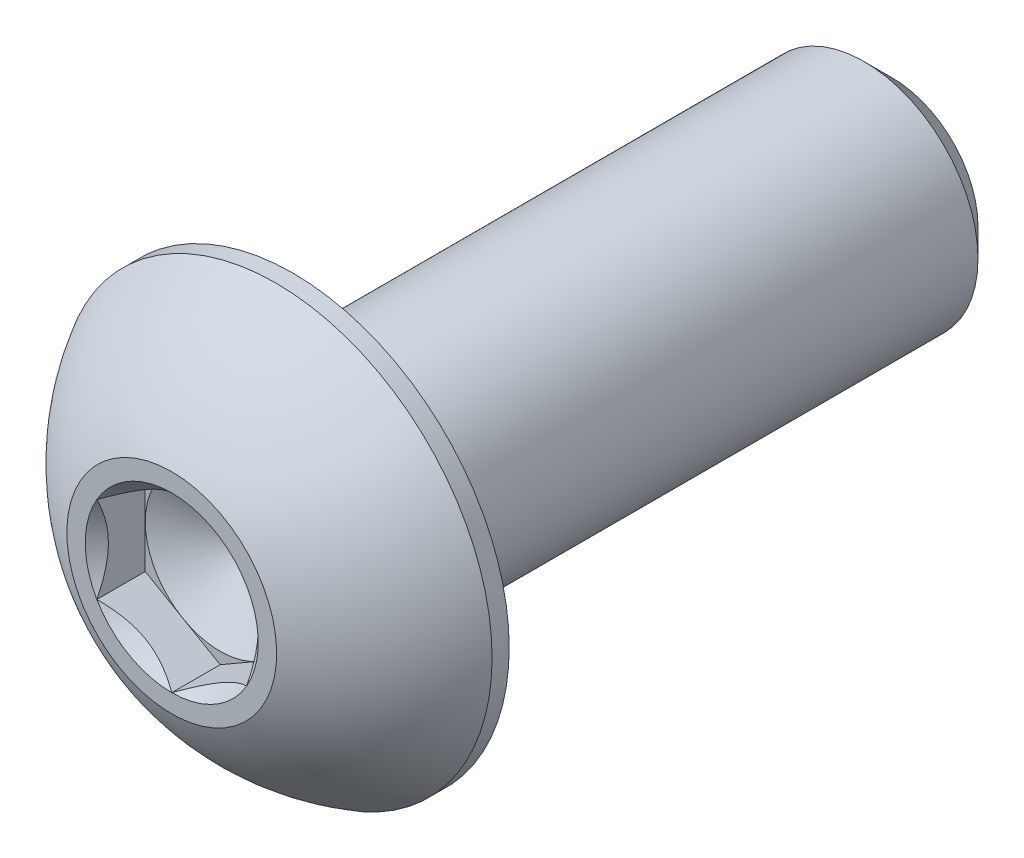
ISO-10303-21;
HEADER;
FILE_DESCRIPTION(('STEP AP214'),'2;1');
FILE_NAME('part.step','',(''),(''),'','','');
FILE_SCHEMA(('AUTOMOTIVE_DESIGN { 1 0 10303 214 1 1 1 1 }'));
ENDSEC;
DATA;
#1=APPLICATION_CONTEXT('core data for automotive mechanical design processes');
#2=APPLICATION_PROTOCOL_DEFINITION('international standard','automotive_design',2000,#1);
#3=PRODUCT_CONTEXT('',#1,'mechanical');
#4=PRODUCT('Part','Part','',(#3));
#5=PRODUCT_RELATED_PRODUCT_CATEGORY('part','',(#4));
#6=PRODUCT_DEFINITION_FORMATION('','',#4);
#7=PRODUCT_DEFINITION_CONTEXT('part definition',#1,'design');
#8=PRODUCT_DEFINITION('design','',#6,#7);
#9=PRODUCT_DEFINITION_SHAPE('','',#8);
#10=(LENGTH_UNIT() NAMED_UNIT(*) SI_UNIT(.MILLI.,.METRE.));
#11=(NAMED_UNIT(*) PLANE_ANGLE_UNIT() SI_UNIT($,.RADIAN.));
#12=(NAMED_UNIT(*) SI_UNIT($,.STERADIAN.) SOLID_ANGLE_UNIT());
#13=UNCERTAINTY_MEASURE_WITH_UNIT(LENGTH_MEASURE(1.E-05),#10,'distance_accuracy_value','');
#14=(GEOMETRIC_REPRESENTATION_CONTEXT(3) GLOBAL_UNCERTAINTY_ASSIGNED_CONTEXT((#13)) GLOBAL_UNIT_ASSIGNED_CONTEXT((#10,
#11,#12)) REPRESENTATION_CONTEXT('',''));
#15=CARTESIAN_POINT('',(0.,0.,0.));
#16=DIRECTION('',(0.,0.,1.));
#17=DIRECTION('',(1.,0.,0.));
#18=AXIS2_PLACEMENT_3D('',#15,#16,#17);
#19=CARTESIAN_POINT('',(0.,1.5875,7.6327));
#20=DIRECTION('',(0.,0.,-1.));
#21=DIRECTION('',(-1.,0.,0.));
#22=AXIS2_PLACEMENT_3D('',#19,#20,#21);
#23=PLANE('',#22);
#24=CARTESIAN_POINT('',(0.,0.,7.6327));
#25=DIRECTION('',(0.,0.,1.));
#26=DIRECTION('',(1.,0.,0.));
#27=AXIS2_PLACEMENT_3D('',#24,#25,#26);
#28=CIRCLE('',#27,2.2225);
#29=CARTESIAN_POINT('',(0.,2.2225,7.6327));
#30=VERTEX_POINT('',#29);
#31=EDGE_CURVE('E169',#30,#30,#28,.T.);
#32=ORIENTED_EDGE('',*,*,#31,.T.);
#33=EDGE_LOOP('',(#32));
#34=FACE_BOUND('',#33,.T.);
#35=CARTESIAN_POINT('',(0.,0.,7.6327));
#36=DIRECTION('',(0.,0.,1.));
#37=DIRECTION('',(1.,0.,0.));
#38=AXIS2_PLACEMENT_3D('',#35,#36,#37);
#39=CIRCLE('',#38,1.83308710467706);
#40=CARTESIAN_POINT('',(0.,1.83308710467706,7.6327));
#41=VERTEX_POINT('',#40);
#42=CARTESIAN_POINT('',(-1.5875,0.916543552338531,7.6327));
#43=VERTEX_POINT('',#42);
#44=EDGE_CURVE('E123',#41,#43,#39,.T.);
#45=ORIENTED_EDGE('',*,*,#44,.F.);
#46=CARTESIAN_POINT('',(0.,0.,7.6327));
#47=DIRECTION('',(0.,0.,1.));
#48=DIRECTION('',(1.,0.,0.));
#49=AXIS2_PLACEMENT_3D('',#46,#47,#48);
#50=CIRCLE('',#49,1.83308710467706);
#51=CARTESIAN_POINT('',(1.5875,0.916543552338531,7.6327));
#52=VERTEX_POINT('',#51);
#53=EDGE_CURVE('E108',#52,#41,#50,.T.);
#54=ORIENTED_EDGE('',*,*,#53,.F.);
#55=CARTESIAN_POINT('',(0.,0.,7.6327));
#56=DIRECTION('',(0.,0.,1.));
#57=DIRECTION('',(1.,0.,0.));
#58=AXIS2_PLACEMENT_3D('',#55,#56,#57);
#59=CIRCLE('',#58,1.83308710467706);
#60=CARTESIAN_POINT('',(1.5875,-0.916543552338531,7.6327));
#61=VERTEX_POINT('',#60);
#62=EDGE_CURVE('E119',#61,#52,#59,.T.);
#63=ORIENTED_EDGE('',*,*,#62,.F.);
#64=CARTESIAN_POINT('',(0.,0.,7.6327));
#65=DIRECTION('',(0.,0.,1.));
#66=DIRECTION('',(1.,0.,0.));
#67=AXIS2_PLACEMENT_3D('',#64,#65,#66);
#68=CIRCLE('',#67,1.83308710467706);
#69=CARTESIAN_POINT('',(0.,-1.83308710467706,7.6327));
#70=VERTEX_POINT('',#69);
#71=EDGE_CURVE('E140',#70,#61,#68,.T.);
#72=ORIENTED_EDGE('',*,*,#71,.F.);
#73=CARTESIAN_POINT('',(0.,0.,7.6327));
#74=DIRECTION('',(0.,0.,1.));
#75=DIRECTION('',(1.,0.,0.));
#76=AXIS2_PLACEMENT_3D('',#73,#74,#75);
#77=CIRCLE('',#76,1.83308710467706);
#78=CARTESIAN_POINT('',(-1.5875,-0.916543552338533,7.6327));
#79=VERTEX_POINT('',#78);
#80=EDGE_CURVE('E396',#79,#70,#77,.T.);
#81=ORIENTED_EDGE('',*,*,#80,.F.);
#82=CARTESIAN_POINT('',(0.,0.,7.6327));
#83=DIRECTION('',(0.,0.,1.));
#84=DIRECTION('',(1.,0.,0.));
#85=AXIS2_PLACEMENT_3D('',#82,#83,#84);
#86=CIRCLE('',#85,1.83308710467706);
#87=EDGE_CURVE('E405',#43,#79,#86,.T.);
#88=ORIENTED_EDGE('',*,*,#87,.F.);
#89=EDGE_LOOP('',(#45,#54,#63,#72,#81,#88));
#90=FACE_BOUND('',#89,.T.);
#91=ADVANCED_FACE('F35',(#34,#90),#23,.F.);
#92=CARTESIAN_POINT('',(0.,0.,-7.6327));
#93=DIRECTION('',(0.,0.,1.));
#94=DIRECTION('',(1.,0.,0.));
#95=AXIS2_PLACEMENT_3D('',#92,#93,#94);
#96=CONICAL_SURFACE('',#95,1.8176875,0.785398163397447);
#97=CARTESIAN_POINT('',(0.,0.,-7.0373875));
#98=DIRECTION('',(0.,0.,1.));
#99=DIRECTION('',(1.,0.,0.));
#100=AXIS2_PLACEMENT_3D('',#97,#98,#99);
#101=CIRCLE('',#100,2.413);
#102=CARTESIAN_POINT('',(2.413,0.,-7.0373875));
#103=VERTEX_POINT('',#102);
#104=EDGE_CURVE('E11',#103,#103,#101,.T.);
#105=ORIENTED_EDGE('',*,*,#104,.F.);
#106=EDGE_LOOP('',(#105));
#107=FACE_BOUND('',#106,.T.);
#108=CARTESIAN_POINT('',(0.,0.,-7.6327));
#109=DIRECTION('',(0.,0.,1.));
#110=DIRECTION('',(1.,0.,0.));
#111=AXIS2_PLACEMENT_3D('',#108,#109,#110);
#112=CIRCLE('',#111,1.8176875);
#113=CARTESIAN_POINT('',(1.8176875,0.,-7.6327));
#114=VERTEX_POINT('',#113);
#115=EDGE_CURVE('E162',#114,#114,#112,.T.);
#116=ORIENTED_EDGE('',*,*,#115,.T.);
#117=EDGE_LOOP('',(#116));
#118=FACE_BOUND('',#117,.T.);
#119=ADVANCED_FACE('F37',(#107,#118),#96,.T.);
#120=CARTESIAN_POINT('',(0.,0.,7.6327));
#121=DIRECTION('',(0.,0.,1.));
#122=DIRECTION('',(1.,0.,0.));
#123=AXIS2_PLACEMENT_3D('',#120,#121,#122);
#124=CYLINDRICAL_SURFACE('',#123,2.413);
#125=CARTESIAN_POINT('',(0.,0.,5.0673));
#126=DIRECTION('',(0.,0.,1.));
#127=DIRECTION('',(1.,0.,0.));
#128=AXIS2_PLACEMENT_3D('',#125,#126,#127);
#129=CIRCLE('',#128,2.413);
#130=CARTESIAN_POINT('',(2.413,0.,5.0673));
#131=VERTEX_POINT('',#130);
#132=EDGE_CURVE('E43',#131,#131,#129,.T.);
#133=ORIENTED_EDGE('',*,*,#132,.F.);
#134=EDGE_LOOP('',(#133));
#135=FACE_BOUND('',#134,.T.);
#136=ORIENTED_EDGE('',*,*,#104,.T.);
#137=EDGE_LOOP('',(#136));
#138=FACE_BOUND('',#137,.T.);
#139=ADVANCED_FACE('F183',(#135,#138),#124,.T.);
#140=CARTESIAN_POINT('',(0.,4.5847,5.0673));
#141=DIRECTION('',(0.,0.,1.));
#142=DIRECTION('',(1.,0.,0.));
#143=AXIS2_PLACEMENT_3D('',#140,#141,#142);
#144=PLANE('',#143);
#145=CARTESIAN_POINT('',(0.,0.,5.0673));
#146=DIRECTION('',(0.,0.,1.));
#147=DIRECTION('',(1.,0.,0.));
#148=AXIS2_PLACEMENT_3D('',#145,#146,#147);
#149=CIRCLE('',#148,4.5847);
#150=CARTESIAN_POINT('',(4.5847,0.,5.0673));
#151=VERTEX_POINT('',#150);
#152=EDGE_CURVE('E176',#151,#151,#149,.T.);
#153=ORIENTED_EDGE('',*,*,#152,.F.);
#154=EDGE_LOOP('',(#153));
#155=FACE_BOUND('',#154,.T.);
#156=ORIENTED_EDGE('',*,*,#132,.T.);
#157=EDGE_LOOP('',(#156));
#158=FACE_BOUND('',#157,.T.);
#159=ADVANCED_FACE('F181',(#155,#158),#144,.F.);
#160=CARTESIAN_POINT('',(0.,0.,7.6327));
#161=DIRECTION('',(0.,0.,1.));
#162=DIRECTION('',(1.,0.,0.));
#163=AXIS2_PLACEMENT_3D('',#160,#161,#162);
#164=CYLINDRICAL_SURFACE('',#163,4.5847);
#165=CARTESIAN_POINT('',(0.,0.,5.43015714285714));
#166=DIRECTION('',(0.,0.,1.));
#167=DIRECTION('',(1.,0.,0.));
#168=AXIS2_PLACEMENT_3D('',#165,#166,#167);
#169=CIRCLE('',#168,4.5847);
#170=CARTESIAN_POINT('',(0.,4.5847,5.43015714285714));
#171=VERTEX_POINT('',#170);
#172=EDGE_CURVE('E173',#171,#171,#169,.T.);
#173=ORIENTED_EDGE('',*,*,#172,.F.);
#174=EDGE_LOOP('',(#173));
#175=FACE_BOUND('',#174,.T.);
#176=ORIENTED_EDGE('',*,*,#152,.T.);
#177=EDGE_LOOP('',(#176));
#178=FACE_BOUND('',#177,.T.);
#179=ADVANCED_FACE('F203',(#175,#178),#164,.T.);
#180=CARTESIAN_POINT('',(0.,0.,2.8811096257943));
#181=DIRECTION('',(0.,0.,1.));
#182=DIRECTION('',(0.,1.,0.));
#183=AXIS2_PLACEMENT_3D('',#180,#181,#182);
#184=SPHERICAL_SURFACE('',#183,5.24567606074224);
#185=CARTESIAN_POINT('',(0.,2.2225,7.6327));
#186=CARTESIAN_POINT('',(0.,2.2534773813734,7.61821074824653));
#187=CARTESIAN_POINT('',(0.,2.28431303158804,7.60341848625839));
#188=CARTESIAN_POINT('',(0.,2.34568916388881,7.57323378101716));
#189=CARTESIAN_POINT('',(0.,2.37622964597494,7.55784133776408));
#190=CARTESIAN_POINT('',(0.,2.43700373620763,7.52646210919738));
#191=CARTESIAN_POINT('',(0.,2.46723734435421,7.51047532388377));
#192=CARTESIAN_POINT('',(0.,2.52738612853076,7.47791353925455));
#193=CARTESIAN_POINT('',(0.,2.55730130456074,7.46133853993896));
#194=CARTESIAN_POINT('',(0.,2.61680178002346,7.42760666387771));
#195=CARTESIAN_POINT('',(0.,2.64638707945621,7.41044978713206));
#196=CARTESIAN_POINT('',(0.,2.70521648559601,7.37556071977142));
#197=CARTESIAN_POINT('',(0.,2.73446059230307,7.35782852915643));
#198=CARTESIAN_POINT('',(0.,2.79259642678969,7.32179561649605));
#199=CARTESIAN_POINT('',(0.,2.82148815456926,7.30349489445066));
#200=CARTESIAN_POINT('',(0.,2.87890817994248,7.26633191915285));
#201=CARTESIAN_POINT('',(0.,2.90743647753613,7.24746966590042));
#202=CARTESIAN_POINT('',(0.,2.96411873025195,7.20919084311661));
#203=CARTESIAN_POINT('',(0.,2.99227268537412,7.18977427358522));
#204=CARTESIAN_POINT('',(0.,3.04819548406127,7.15039424522424));
#205=CARTESIAN_POINT('',(0.,3.07596432762624,7.13043078639465));
#206=CARTESIAN_POINT('',(0.,3.13110628141819,7.08996461560096));
#207=CARTESIAN_POINT('',(0.,3.15847939164516,7.06946190363687));
#208=CARTESIAN_POINT('',(0.,3.21281940835191,7.02792506900768));
#209=CARTESIAN_POINT('',(0.,3.23978631483169,7.00689094634259));
#210=CARTESIAN_POINT('',(0.,3.29330360901048,6.96429933601284));
#211=CARTESIAN_POINT('',(0.,3.31985399670949,6.94274184834818));
#212=CARTESIAN_POINT('',(0.,3.37252809761461,6.89911175391169));
#213=CARTESIAN_POINT('',(0.,3.39865181082073,6.87703914713985));
#214=CARTESIAN_POINT('',(0.,3.45046257023396,6.83238725741808));
#215=CARTESIAN_POINT('',(0.,3.47614961644107,6.80980797446814));
#216=CARTESIAN_POINT('',(0.,3.5270772163784,6.76415136912649));
#217=CARTESIAN_POINT('',(0.,3.55231777010863,6.74107404673478));
#218=CARTESIAN_POINT('',(0.,3.60234273040088,6.69443018974953));
#219=CARTESIAN_POINT('',(0.,3.6271271369629,6.670863655156));
#220=CARTESIAN_POINT('',(0.,3.67623032270693,6.62325038813422));
#221=CARTESIAN_POINT('',(0.,3.70054910188895,6.59920365570597));
#222=CARTESIAN_POINT('',(0.,3.74871173076698,6.55063919106094));
#223=CARTESIAN_POINT('',(0.,3.77255558046298,6.52612145884416));
#224=CARTESIAN_POINT('',(0.,3.8197592299269,6.47662437282903));
#225=CARTESIAN_POINT('',(0.,3.8431190296948,6.45164501903068));
#226=CARTESIAN_POINT('',(0.,3.88934564401292,6.4012342446329));
#227=CARTESIAN_POINT('',(0.,3.91221245856314,6.37580282403346));
#228=CARTESIAN_POINT('',(0.,3.95744435572676,6.32449764373282));
#229=CARTESIAN_POINT('',(0.,3.97980943834017,6.29862388403162));
#230=CARTESIAN_POINT('',(0.,4.02402931682667,6.24644392242435));
#231=CARTESIAN_POINT('',(0.,4.04588411269977,6.2201377205183));
#232=CARTESIAN_POINT('',(0.,4.08907505809202,6.16710293681139));
#233=CARTESIAN_POINT('',(0.,4.11041120761118,6.14037435501054));
#234=CARTESIAN_POINT('',(0.,4.15255669906197,6.086505035384));
#235=CARTESIAN_POINT('',(0.,4.17336604099361,6.05936429755832));
#236=CARTESIAN_POINT('',(0.,4.21444995756537,6.00468104741742));
#237=CARTESIAN_POINT('',(0.,4.23472453220549,5.97713853510222));
#238=CARTESIAN_POINT('',(0.,4.27473115896065,5.92166227115159));
#239=CARTESIAN_POINT('',(0.,4.2944632110757,5.89372851951617));
#240=CARTESIAN_POINT('',(0.,4.33337724537132,5.83748046192396));
#241=CARTESIAN_POINT('',(0.,4.3525592275519,5.80916615596717));
#242=CARTESIAN_POINT('',(0.,4.39036578383499,5.75216781963255));
#243=CARTESIAN_POINT('',(0.,4.40899035793751,5.72348378925471));
#244=CARTESIAN_POINT('',(0.,4.44567497738742,5.66575697787584));
#245=CARTESIAN_POINT('',(0.,4.46373502273481,5.6367141968748));
#246=CARTESIAN_POINT('',(0.,4.49928366405765,5.57828098603411));
#247=CARTESIAN_POINT('',(0.,4.5167722600331,5.54889055619445));
#248=CARTESIAN_POINT('',(0.,4.55117135982878,5.48977331691564));
#249=CARTESIAN_POINT('',(0.,4.56808186364901,5.46004650747649));
#250=CARTESIAN_POINT('',(0.,4.5847,5.43015714285714));
#251=B_SPLINE_CURVE_WITH_KNOTS('',3,(#185,#186,#187,#188,#189,#190,#191,#192,#193,#194,#195,
#196,#197,#198,#199,#200,#201,#202,#203,#204,#205,#206,#207,#208,#209,#210,#211,#212,#213,#214,
#215,#216,#217,#218,#219,#220,#221,#222,#223,#224,#225,#226,#227,#228,#229,#230,#231,#232,#233,
#234,#235,#236,#237,#238,#239,#240,#241,#242,#243,#244,#245,#246,#247,#248,#249,#250),
.UNSPECIFIED.,.F.,.F.,(4,2,2,2,2,2,2,2,2,2,2,2,2,2,2,2,2,2,2,2,2,2,2,2,2,2,2,2,2,2,2,2,4),(0.,
0.102593825831513,0.205187651663027,0.307781477494542,0.410375303326055,0.512969129157568,
0.615562954989083,0.718156780820596,0.82075060665211,0.923344432483623,1.02593825831514,
1.12853208414665,1.23112590997816,1.33371973580968,1.43631356164119,1.53890738747271,
1.64150121330422,1.74409503913573,1.84668886496725,1.94928269079876,2.05187651663027,
2.15447034246179,2.2570641682933,2.35965799412482,2.46225181995633,2.56484564578784,
2.66743947161936,2.77003329745087,2.87262712328238,2.9752209491139,3.07781477494541,
3.18040860077693,3.28300242660844),.UNSPECIFIED.);
#252=EDGE_CURVE('BSEAM194',#30,#171,#251,.T.);
#253=ORIENTED_EDGE('',*,*,#31,.F.);
#254=ORIENTED_EDGE('',*,*,#172,.T.);
#255=ORIENTED_EDGE('',*,*,#252,.T.);
#256=ORIENTED_EDGE('',*,*,#252,.F.);
#257=EDGE_LOOP('',(#253,#255,#254,#256));
#258=FACE_BOUND('',#257,.T.);
#259=ADVANCED_FACE('F194',(#258),#184,.T.);
#260=CARTESIAN_POINT('',(0.,1.8176875,-7.6327));
#261=DIRECTION('',(0.,0.,1.));
#262=DIRECTION('',(1.,0.,0.));
#263=AXIS2_PLACEMENT_3D('',#260,#261,#262);
#264=PLANE('',#263);
#265=ORIENTED_EDGE('',*,*,#115,.F.);
#266=EDGE_LOOP('',(#265));
#267=FACE_BOUND('',#266,.T.);
#268=ADVANCED_FACE('F192',(#267),#264,.F.);
#269=CARTESIAN_POINT('',(1.5875,0.916543552338532,7.6327));
#270=DIRECTION('',(-0.499999999999999,-0.866025403784439,0.));
#271=DIRECTION('',(0.866025403784439,-0.499999999999999,0.));
#272=AXIS2_PLACEMENT_3D('',#269,#270,#271);
#273=PLANE('',#272);
#274=CARTESIAN_POINT('',(1.5877,0.916428082284694,7.63281548096371));
#275=CARTESIAN_POINT('',(1.53312479190086,0.94793709337181,7.6013308083706));
#276=CARTESIAN_POINT('',(1.47763696320971,0.979973006203396,7.57169504601353));
#277=CARTESIAN_POINT('',(1.36449087915364,1.04529792829092,7.51743226002082));
#278=CARTESIAN_POINT('',(1.30682185887062,1.07859315267522,7.49283543513318));
#279=CARTESIAN_POINT('',(1.1905349781269,1.14573141457583,7.45070036427258));
#280=CARTESIAN_POINT('',(1.13194674474407,1.17955734689075,7.43305619272982));
#281=CARTESIAN_POINT('',(1.01348022674557,1.24795402294715,7.40587147008497));
#282=CARTESIAN_POINT('',(0.953605562983894,1.28252267618759,7.39631062069508));
#283=CARTESIAN_POINT('',(0.850418771876556,1.34209759781022,7.38768441310401));
#284=CARTESIAN_POINT('',(0.807240015952286,1.36702686416637,7.38640719280958));
#285=CARTESIAN_POINT('',(0.720953038535397,1.41684467380557,7.3885570558147));
#286=CARTESIAN_POINT('',(0.67784484707861,1.44173319974743,7.39198578854934));
#287=CARTESIAN_POINT('',(0.592046335002029,1.49126899379091,7.40335099443334));
#288=CARTESIAN_POINT('',(0.549356408925404,1.51591603410293,7.41129137180164));
#289=CARTESIAN_POINT('',(0.464693063478357,1.56479643938728,7.4312484144511));
#290=CARTESIAN_POINT('',(0.422719959755072,1.58902962212064,7.44326682920869));
#291=CARTESIAN_POINT('',(0.315211458113564,1.65109968448354,7.47894689724725));
#292=CARTESIAN_POINT('',(0.250342771708898,1.68855163804125,7.50529857230314));
#293=CARTESIAN_POINT('',(0.154961599380923,1.74361998356043,7.5497835368517));
#294=CARTESIAN_POINT('',(0.123530699536156,1.76176662204668,7.56541285780113));
#295=CARTESIAN_POINT('',(0.0612469855696361,1.79772614107138,7.5980984878611));
#296=CARTESIAN_POINT('',(0.0303939039605758,1.8155391760437,7.61515411565697));
#297=CARTESIAN_POINT('',(-0.00020000000000099,1.8332025747309,7.63281548096371));
#298=B_SPLINE_CURVE_WITH_KNOTS('',3,(#274,#275,#276,#277,#278,#279,#280,#281,#282,#283,#284,
#285,#286,#287,#288,#289,#290,#291,#292,#293,#294,#295,#296,#297),.UNSPECIFIED.,.F.,.F.,(4,2,2,
2,2,2,2,2,2,2,2,4),(0.,0.211482650810817,0.424197870807277,0.633533884524817,0.84234265326335,
0.991755553727143,1.14122083674205,1.29081565918878,1.44047473906438,1.6781878086972,
1.79671410024894,1.91518409436631),.UNSPECIFIED.);
#299=EDGE_CURVE('E105',#52,#41,#298,.T.);
#300=ORIENTED_EDGE('',*,*,#299,.T.);
#301=DIRECTION('',(0.,0.,-1.));
#302=VECTOR('',#301,1.);
#303=CARTESIAN_POINT('',(0.,1.83308710467706,7.6327));
#304=LINE('',#303,#302);
#305=CARTESIAN_POINT('',(0.,1.83308710467706,6.60654));
#306=VERTEX_POINT('',#305);
#307=EDGE_CURVE('E160',#41,#306,#304,.T.);
#308=ORIENTED_EDGE('',*,*,#307,.T.);
#309=DIRECTION('',(-0.866025403784439,0.499999999999999,0.));
#310=VECTOR('',#309,1.);
#311=CARTESIAN_POINT('',(1.5875,0.916543552338532,6.60654));
#312=LINE('',#311,#310);
#313=CARTESIAN_POINT('',(0.793749999999999,1.3748153285078,6.60654));
#314=VERTEX_POINT('',#313);
#315=EDGE_CURVE('E432',#314,#306,#312,.T.);
#316=ORIENTED_EDGE('',*,*,#315,.F.);
#317=CARTESIAN_POINT('',(1.5875,0.916543552338532,6.60654));
#318=VERTEX_POINT('',#317);
#319=EDGE_CURVE('E50',#318,#314,#312,.T.);
#320=ORIENTED_EDGE('',*,*,#319,.F.);
#321=DIRECTION('',(0.,0.,-1.));
#322=VECTOR('',#321,1.);
#323=CARTESIAN_POINT('',(1.5875,0.916543552338532,7.6327));
#324=LINE('',#323,#322);
#325=EDGE_CURVE('E136',#52,#318,#324,.T.);
#326=ORIENTED_EDGE('',*,*,#325,.F.);
#327=EDGE_LOOP('',(#300,#308,#316,#320,#326));
#328=FACE_BOUND('',#327,.T.);
#329=ADVANCED_FACE('F142',(#328),#273,.T.);
#330=CARTESIAN_POINT('',(0.,1.83308710467706,7.6327));
#331=DIRECTION('',(0.500000000000001,-0.866025403784438,0.));
#332=DIRECTION('',(0.866025403784438,0.500000000000001,0.));
#333=AXIS2_PLACEMENT_3D('',#330,#331,#332);
#334=PLANE('',#333);
#335=CARTESIAN_POINT('',(0.000199999999998877,1.8332025747309,7.63281548096371));
#336=CARTESIAN_POINT('',(-0.0543752080991375,1.80169356364378,7.6013308083706));
#337=CARTESIAN_POINT('',(-0.109863036790291,1.7696576508122,7.57169504601353));
#338=CARTESIAN_POINT('',(-0.22300912084636,1.70433272872467,7.51743226002082));
#339=CARTESIAN_POINT('',(-0.280678141129382,1.67103750434037,7.49283543513318));
#340=CARTESIAN_POINT('',(-0.396965021873104,1.60389924243976,7.45070036427258));
#341=CARTESIAN_POINT('',(-0.455553255255932,1.57007331012484,7.43305619272982));
#342=CARTESIAN_POINT('',(-0.574019773254431,1.50167663406845,7.40587147008497));
#343=CARTESIAN_POINT('',(-0.633894437016105,1.46710798082801,7.39631062069508));
#344=CARTESIAN_POINT('',(-0.737081228123443,1.40753305920537,7.38768441310401));
#345=CARTESIAN_POINT('',(-0.780259984047713,1.38260379284922,7.38640719280957));
#346=CARTESIAN_POINT('',(-0.866546961464602,1.33278598321002,7.3885570558147));
#347=CARTESIAN_POINT('',(-0.909655152921388,1.30789745726817,7.39198578854934));
#348=CARTESIAN_POINT('',(-0.99545366499797,1.25836166322468,7.40335099443334));
#349=CARTESIAN_POINT('',(-1.03814359107459,1.23371462291266,7.41129137180164));
#350=CARTESIAN_POINT('',(-1.12280693652164,1.18483421762831,7.4312484144511));
#351=CARTESIAN_POINT('',(-1.16478004024493,1.16060103489495,7.44326682920869));
#352=CARTESIAN_POINT('',(-1.27228854188643,1.09853097253205,7.47894689724724));
#353=CARTESIAN_POINT('',(-1.3371572282911,1.06107901897434,7.50529857230314));
#354=CARTESIAN_POINT('',(-1.43253840061908,1.00601067345516,7.5497835368517));
#355=CARTESIAN_POINT('',(-1.46396930046384,0.987864034968913,7.56541285780113));
#356=CARTESIAN_POINT('',(-1.52625301443036,0.951904515944213,7.5980984878611));
#357=CARTESIAN_POINT('',(-1.55710609603942,0.934091480971893,7.61515411565697));
#358=CARTESIAN_POINT('',(-1.5877,0.916428082284692,7.63281548096371));
#359=B_SPLINE_CURVE_WITH_KNOTS('',3,(#335,#336,#337,#338,#339,#340,#341,#342,#343,#344,#345,
#346,#347,#348,#349,#350,#351,#352,#353,#354,#355,#356,#357,#358),.UNSPECIFIED.,.F.,.F.,(4,2,2,
2,2,2,2,2,2,2,2,4),(0.,0.211482650810816,0.424197870807275,0.633533884524815,0.842342653263348,
0.991755553727141,1.14122083674204,1.29081565918877,1.44047473906438,1.6781878086972,
1.79671410024894,1.91518409436631),.UNSPECIFIED.);
#360=EDGE_CURVE('E420',#41,#43,#359,.T.);
#361=ORIENTED_EDGE('',*,*,#360,.T.);
#362=DIRECTION('',(0.,0.,-1.));
#363=VECTOR('',#362,1.);
#364=CARTESIAN_POINT('',(-1.5875,0.91654355233853,7.6327));
#365=LINE('',#364,#363);
#366=CARTESIAN_POINT('',(-1.5875,0.91654355233853,6.60654));
#367=VERTEX_POINT('',#366);
#368=EDGE_CURVE('E157',#43,#367,#365,.T.);
#369=ORIENTED_EDGE('',*,*,#368,.T.);
#370=DIRECTION('',(-0.866025403784438,-0.5,0.));
#371=VECTOR('',#370,1.);
#372=CARTESIAN_POINT('',(0.,1.83308710467706,6.60654));
#373=LINE('',#372,#371);
#374=CARTESIAN_POINT('',(-0.793750000000001,1.3748153285078,6.60654));
#375=VERTEX_POINT('',#374);
#376=EDGE_CURVE('E434',#375,#367,#373,.T.);
#377=ORIENTED_EDGE('',*,*,#376,.F.);
#378=EDGE_CURVE('E435',#306,#375,#373,.T.);
#379=ORIENTED_EDGE('',*,*,#378,.F.);
#380=ORIENTED_EDGE('',*,*,#307,.F.);
#381=EDGE_LOOP('',(#361,#369,#377,#379,#380));
#382=FACE_BOUND('',#381,.T.);
#383=ADVANCED_FACE('F201',(#382),#334,.T.);
#384=CARTESIAN_POINT('',(-1.5875,0.91654355233853,7.6327));
#385=DIRECTION('',(1.,0.,0.));
#386=DIRECTION('',(0.,1.,0.));
#387=AXIS2_PLACEMENT_3D('',#384,#385,#386);
#388=PLANE('',#387);
#389=CARTESIAN_POINT('',(-1.5875,-1.8064504268921,8.20448698658398));
#390=CARTESIAN_POINT('',(-1.5875,-1.76236619947005,8.17137765189215));
#391=CARTESIAN_POINT('',(-1.5875,-1.71803401722459,8.13859936728741));
#392=CARTESIAN_POINT('',(-1.5875,-1.62877387436181,8.07384092729782));
#393=CARTESIAN_POINT('',(-1.5875,-1.58384576476286,8.04186097748321));
#394=CARTESIAN_POINT('',(-1.5875,-1.44736053267712,7.94686696154791));
#395=CARTESIAN_POINT('',(-1.5875,-1.3547728804759,7.88530882424476));
#396=CARTESIAN_POINT('',(-1.5875,-1.16075761948671,7.76465751972008));
#397=CARTESIAN_POINT('',(-1.5875,-1.05912459725148,7.70589084409804));
#398=CARTESIAN_POINT('',(-1.5875,-0.850810108093356,7.59853067812025));
#399=CARTESIAN_POINT('',(-1.5875,-0.744147188151384,7.5499029254242));
#400=CARTESIAN_POINT('',(-1.5875,-0.583837187923045,7.49041807950615));
#401=CARTESIAN_POINT('',(-1.5875,-0.532518160842359,7.47331011476258));
#402=CARTESIAN_POINT('',(-1.5875,-0.428659985513867,7.44321705307571));
#403=CARTESIAN_POINT('',(-1.5875,-0.376120751676571,7.43023224628787));
#404=CARTESIAN_POINT('',(-1.5875,-0.271003698108569,7.40927039746268));
#405=CARTESIAN_POINT('',(-1.5875,-0.218442994151923,7.40120885122062));
#406=CARTESIAN_POINT('',(-1.5875,-0.112783135871373,7.39024746810392));
#407=CARTESIAN_POINT('',(-1.5875,-0.0596840710482703,7.38734678695656));
#408=CARTESIAN_POINT('',(-1.5875,0.0447055832560291,7.38691381931861));
#409=CARTESIAN_POINT('',(-1.5875,0.0959954901561846,7.38920012793679));
#410=CARTESIAN_POINT('',(-1.5875,0.198125185705279,7.39861970580147));
#411=CARTESIAN_POINT('',(-1.5875,0.248964929488491,7.40575345278263));
#412=CARTESIAN_POINT('',(-1.5875,0.350686556652122,7.42460310969938));
#413=CARTESIAN_POINT('',(-1.5875,0.401553911407876,7.43639626149498));
#414=CARTESIAN_POINT('',(-1.5875,0.502179810539459,7.46394443755636));
#415=CARTESIAN_POINT('',(-1.5875,0.551938454553038,7.47969910423224));
#416=CARTESIAN_POINT('',(-1.5875,0.709597941546691,7.53551737605638));
#417=CARTESIAN_POINT('',(-1.5875,0.815228306930166,7.58197915633839));
#418=CARTESIAN_POINT('',(-1.5875,1.02151735170486,7.68525145508529));
#419=CARTESIAN_POINT('',(-1.5875,1.12215634479547,7.74209935808162));
#420=CARTESIAN_POINT('',(-1.5875,1.31447644029508,7.85934912470739));
#421=CARTESIAN_POINT('',(-1.5875,1.40635401847359,7.91943268451341));
#422=CARTESIAN_POINT('',(-1.5875,1.54171769329396,8.01230190804474));
#423=CARTESIAN_POINT('',(-1.5875,1.58625419266992,8.04358312786968));
#424=CARTESIAN_POINT('',(-1.5875,1.67471932537719,8.10696920360769));
#425=CARTESIAN_POINT('',(-1.5875,1.71864812234279,8.13907383088692));
#426=CARTESIAN_POINT('',(-1.5875,1.76232404534813,8.17151978447609));
#427=B_SPLINE_CURVE_WITH_KNOTS('',3,(#389,#390,#391,#392,#393,#394,#395,#396,#397,#398,#399,
#400,#401,#402,#403,#404,#405,#406,#407,#408,#409,#410,#411,#412,#413,#414,#415,#416,#417,#418,
#419,#420,#421,#422,#423,#424,#425,#426),.UNSPECIFIED.,.F.,.F.,(4,2,2,2,2,2,2,2,2,2,2,2,2,2,2,2,
2,2,4),(0.,0.165394720611771,0.330831599805601,0.664230904656282,1.01613642769877,
1.36683276443451,1.5289815746679,1.69114179313303,1.85043410106595,2.00970034776346,
2.16348276168557,2.31728033368487,2.47374234648083,2.63019024115108,2.97536284656899,
3.32180328575216,3.65097853196649,3.8142455159316,3.97746764647571),.UNSPECIFIED.);
#428=EDGE_CURVE('E413',#43,#79,#427,.F.);
#429=ORIENTED_EDGE('',*,*,#428,.T.);
#430=DIRECTION('',(0.,0.,-1.));
#431=VECTOR('',#430,1.);
#432=CARTESIAN_POINT('',(-1.5875,-0.916543552338532,7.6327));
#433=LINE('',#432,#431);
#434=CARTESIAN_POINT('',(-1.5875,-0.916543552338532,6.60654));
#435=VERTEX_POINT('',#434);
#436=EDGE_CURVE('E154',#79,#435,#433,.T.);
#437=ORIENTED_EDGE('',*,*,#436,.T.);
#438=DIRECTION('',(0.,-1.,0.));
#439=VECTOR('',#438,1.);
#440=CARTESIAN_POINT('',(-1.5875,0.91654355233853,6.60654));
#441=LINE('',#440,#439);
#442=CARTESIAN_POINT('',(-1.5875,0.,6.60654));
#443=VERTEX_POINT('',#442);
#444=EDGE_CURVE('E438',#443,#435,#441,.T.);
#445=ORIENTED_EDGE('',*,*,#444,.F.);
#446=EDGE_CURVE('E439',#367,#443,#441,.T.);
#447=ORIENTED_EDGE('',*,*,#446,.F.);
#448=ORIENTED_EDGE('',*,*,#368,.F.);
#449=EDGE_LOOP('',(#429,#437,#445,#447,#448));
#450=FACE_BOUND('',#449,.T.);
#451=ADVANCED_FACE('F256',(#450),#388,.T.);
#452=CARTESIAN_POINT('',(-1.5875,-0.916543552338532,7.6327));
#453=DIRECTION('',(0.499999999999999,0.866025403784439,0.));
#454=DIRECTION('',(-0.866025403784439,0.5,0.));
#455=AXIS2_PLACEMENT_3D('',#452,#453,#454);
#456=PLANE('',#455);
#457=CARTESIAN_POINT('',(-1.5877,-0.916428082284694,7.63281548096371));
#458=CARTESIAN_POINT('',(-1.53312479190086,-0.94793709337181,7.6013308083706));
#459=CARTESIAN_POINT('',(-1.47763696320971,-0.979973006203396,7.57169504601353));
#460=CARTESIAN_POINT('',(-1.36449087915364,-1.04529792829092,7.51743226002082));
#461=CARTESIAN_POINT('',(-1.30682185887062,-1.07859315267522,7.49283543513318));
#462=CARTESIAN_POINT('',(-1.1905349781269,-1.14573141457583,7.45070036427258));
#463=CARTESIAN_POINT('',(-1.13194674474407,-1.17955734689075,7.43305619272982));
#464=CARTESIAN_POINT('',(-1.01348022674557,-1.24795402294714,7.40587147008497));
#465=CARTESIAN_POINT('',(-0.953605562983895,-1.28252267618759,7.39631062069508));
#466=CARTESIAN_POINT('',(-0.850418771876557,-1.34209759781022,7.38768441310401));
#467=CARTESIAN_POINT('',(-0.807240015952287,-1.36702686416637,7.38640719280957));
#468=CARTESIAN_POINT('',(-0.720953038535398,-1.41684467380557,7.3885570558147));
#469=CARTESIAN_POINT('',(-0.677844847078611,-1.44173319974742,7.39198578854934));
#470=CARTESIAN_POINT('',(-0.59204633500203,-1.49126899379091,7.40335099443334));
#471=CARTESIAN_POINT('',(-0.549356408925406,-1.51591603410293,7.41129137180164));
#472=CARTESIAN_POINT('',(-0.464693063478358,-1.56479643938728,7.4312484144511));
#473=CARTESIAN_POINT('',(-0.422719959755074,-1.58902962212064,7.44326682920869));
#474=CARTESIAN_POINT('',(-0.315211458113566,-1.65109968448354,7.47894689724724));
#475=CARTESIAN_POINT('',(-0.2503427717089,-1.68855163804125,7.50529857230314));
#476=CARTESIAN_POINT('',(-0.154961599380924,-1.74361998356043,7.5497835368517));
#477=CARTESIAN_POINT('',(-0.123530699536156,-1.76176662204668,7.56541285780113));
#478=CARTESIAN_POINT('',(-0.0612469855696364,-1.79772614107138,7.5980984878611));
#479=CARTESIAN_POINT('',(-0.030393903960576,-1.8155391760437,7.61515411565697));
#480=CARTESIAN_POINT('',(0.00020000000000092,-1.8332025747309,7.63281548096371));
#481=B_SPLINE_CURVE_WITH_KNOTS('',3,(#457,#458,#459,#460,#461,#462,#463,#464,#465,#466,#467,
#468,#469,#470,#471,#472,#473,#474,#475,#476,#477,#478,#479,#480),.UNSPECIFIED.,.F.,.F.,(4,2,2,
2,2,2,2,2,2,2,2,4),(0.,0.211482650810816,0.424197870807275,0.633533884524815,0.842342653263348,
0.991755553727141,1.14122083674204,1.29081565918877,1.44047473906438,1.6781878086972,
1.79671410024894,1.91518409436631),.UNSPECIFIED.);
#482=EDGE_CURVE('E398',#79,#70,#481,.T.);
#483=ORIENTED_EDGE('',*,*,#482,.T.);
#484=DIRECTION('',(0.,0.,-1.));
#485=VECTOR('',#484,1.);
#486=CARTESIAN_POINT('',(0.,-1.83308710467706,7.6327));
#487=LINE('',#486,#485);
#488=CARTESIAN_POINT('',(0.,-1.83308710467706,6.60654));
#489=VERTEX_POINT('',#488);
#490=EDGE_CURVE('E145',#70,#489,#487,.T.);
#491=ORIENTED_EDGE('',*,*,#490,.T.);
#492=DIRECTION('',(0.866025403784439,-0.499999999999999,0.));
#493=VECTOR('',#492,1.);
#494=CARTESIAN_POINT('',(-1.5875,-0.916543552338532,6.60654));
#495=LINE('',#494,#493);
#496=CARTESIAN_POINT('',(-0.793749999999999,-1.3748153285078,6.60654));
#497=VERTEX_POINT('',#496);
#498=EDGE_CURVE('E442',#497,#489,#495,.T.);
#499=ORIENTED_EDGE('',*,*,#498,.F.);
#500=EDGE_CURVE('E443',#435,#497,#495,.T.);
#501=ORIENTED_EDGE('',*,*,#500,.F.);
#502=ORIENTED_EDGE('',*,*,#436,.F.);
#503=EDGE_LOOP('',(#483,#491,#499,#501,#502));
#504=FACE_BOUND('',#503,.T.);
#505=ADVANCED_FACE('F264',(#504),#456,.T.);
#506=CARTESIAN_POINT('',(0.,-1.83308710467706,7.6327));
#507=DIRECTION('',(-0.5,0.866025403784438,0.));
#508=DIRECTION('',(-0.866025403784439,-0.5,0.));
#509=AXIS2_PLACEMENT_3D('',#506,#507,#508);
#510=PLANE('',#509);
#511=CARTESIAN_POINT('',(-0.000199999999998767,-1.8332025747309,7.63281548096371));
#512=CARTESIAN_POINT('',(0.0543752080991375,-1.80169356364378,7.6013308083706));
#513=CARTESIAN_POINT('',(0.109863036790291,-1.7696576508122,7.57169504601353));
#514=CARTESIAN_POINT('',(0.22300912084636,-1.70433272872467,7.51743226002082));
#515=CARTESIAN_POINT('',(0.280678141129382,-1.67103750434037,7.49283543513318));
#516=CARTESIAN_POINT('',(0.396965021873103,-1.60389924243976,7.45070036427258));
#517=CARTESIAN_POINT('',(0.455553255255931,-1.57007331012484,7.43305619272982));
#518=CARTESIAN_POINT('',(0.574019773254431,-1.50167663406845,7.40587147008497));
#519=CARTESIAN_POINT('',(0.633894437016105,-1.46710798082801,7.39631062069508));
#520=CARTESIAN_POINT('',(0.737081228123443,-1.40753305920537,7.38768441310401));
#521=CARTESIAN_POINT('',(0.780259984047712,-1.38260379284922,7.38640719280958));
#522=CARTESIAN_POINT('',(0.866546961464601,-1.33278598321002,7.3885570558147));
#523=CARTESIAN_POINT('',(0.909655152921388,-1.30789745726817,7.39198578854934));
#524=CARTESIAN_POINT('',(0.99545366499797,-1.25836166322469,7.40335099443334));
#525=CARTESIAN_POINT('',(1.03814359107459,-1.23371462291266,7.41129137180164));
#526=CARTESIAN_POINT('',(1.12280693652164,-1.18483421762831,7.4312484144511));
#527=CARTESIAN_POINT('',(1.16478004024493,-1.16060103489495,7.44326682920869));
#528=CARTESIAN_POINT('',(1.27228854188643,-1.09853097253205,7.47894689724725));
#529=CARTESIAN_POINT('',(1.3371572282911,-1.06107901897434,7.50529857230314));
#530=CARTESIAN_POINT('',(1.43253840061908,-1.00601067345516,7.5497835368517));
#531=CARTESIAN_POINT('',(1.46396930046384,-0.987864034968914,7.56541285780113));
#532=CARTESIAN_POINT('',(1.52625301443036,-0.951904515944214,7.5980984878611));
#533=CARTESIAN_POINT('',(1.55710609603942,-0.934091480971894,7.61515411565697));
#534=CARTESIAN_POINT('',(1.5877,-0.916428082284693,7.63281548096371));
#535=B_SPLINE_CURVE_WITH_KNOTS('',3,(#511,#512,#513,#514,#515,#516,#517,#518,#519,#520,#521,
#522,#523,#524,#525,#526,#527,#528,#529,#530,#531,#532,#533,#534),.UNSPECIFIED.,.F.,.F.,(4,2,2,
2,2,2,2,2,2,2,2,4),(0.,0.211482650810816,0.424197870807275,0.633533884524814,0.842342653263347,
0.99175555372714,1.14122083674204,1.29081565918877,1.44047473906437,1.6781878086972,
1.79671410024894,1.91518409436631),.UNSPECIFIED.);
#536=EDGE_CURVE('E389',#70,#61,#535,.T.);
#537=ORIENTED_EDGE('',*,*,#536,.T.);
#538=DIRECTION('',(0.,0.,-1.));
#539=VECTOR('',#538,1.);
#540=CARTESIAN_POINT('',(1.5875,-0.916543552338531,7.6327));
#541=LINE('',#540,#539);
#542=CARTESIAN_POINT('',(1.5875,-0.916543552338531,6.60654));
#543=VERTEX_POINT('',#542);
#544=EDGE_CURVE('E139',#61,#543,#541,.T.);
#545=ORIENTED_EDGE('',*,*,#544,.T.);
#546=DIRECTION('',(0.866025403784438,0.5,0.));
#547=VECTOR('',#546,1.);
#548=CARTESIAN_POINT('',(0.,-1.83308710467706,6.60654));
#549=LINE('',#548,#547);
#550=CARTESIAN_POINT('',(0.793750000000001,-1.3748153285078,6.60654));
#551=VERTEX_POINT('',#550);
#552=EDGE_CURVE('E445',#551,#543,#549,.T.);
#553=ORIENTED_EDGE('',*,*,#552,.F.);
#554=EDGE_CURVE('E446',#489,#551,#549,.T.);
#555=ORIENTED_EDGE('',*,*,#554,.F.);
#556=ORIENTED_EDGE('',*,*,#490,.F.);
#557=EDGE_LOOP('',(#537,#545,#553,#555,#556));
#558=FACE_BOUND('',#557,.T.);
#559=ADVANCED_FACE('F272',(#558),#510,.T.);
#560=CARTESIAN_POINT('',(1.5875,-0.916543552338531,7.6327));
#561=DIRECTION('',(-1.,0.,0.));
#562=DIRECTION('',(0.,-1.,0.));
#563=AXIS2_PLACEMENT_3D('',#560,#561,#562);
#564=PLANE('',#563);
#565=CARTESIAN_POINT('',(1.5875,-1.8064504268921,8.20448698658398));
#566=CARTESIAN_POINT('',(1.5875,-1.76236619947005,8.17137765189215));
#567=CARTESIAN_POINT('',(1.5875,-1.71803401722459,8.13859936728741));
#568=CARTESIAN_POINT('',(1.5875,-1.62877387436181,8.07384092729782));
#569=CARTESIAN_POINT('',(1.5875,-1.58384576476286,8.04186097748321));
#570=CARTESIAN_POINT('',(1.5875,-1.44736053267712,7.94686696154791));
#571=CARTESIAN_POINT('',(1.5875,-1.3547728804759,7.88530882424476));
#572=CARTESIAN_POINT('',(1.5875,-1.16075761948671,7.76465751972008));
#573=CARTESIAN_POINT('',(1.5875,-1.05912459725148,7.70589084409804));
#574=CARTESIAN_POINT('',(1.5875,-0.850810108093355,7.59853067812025));
#575=CARTESIAN_POINT('',(1.5875,-0.744147188151383,7.5499029254242));
#576=CARTESIAN_POINT('',(1.5875,-0.583837187923044,7.49041807950615));
#577=CARTESIAN_POINT('',(1.5875,-0.532518160842358,7.47331011476258));
#578=CARTESIAN_POINT('',(1.5875,-0.428659985513866,7.44321705307571));
#579=CARTESIAN_POINT('',(1.5875,-0.37612075167657,7.43023224628787));
#580=CARTESIAN_POINT('',(1.5875,-0.271003698108568,7.40927039746268));
#581=CARTESIAN_POINT('',(1.5875,-0.218442994151922,7.40120885122062));
#582=CARTESIAN_POINT('',(1.5875,-0.112783135871372,7.39024746810392));
#583=CARTESIAN_POINT('',(1.5875,-0.0596840710482696,7.38734678695656));
#584=CARTESIAN_POINT('',(1.5875,0.0447055832560299,7.38691381931861));
#585=CARTESIAN_POINT('',(1.5875,0.0959954901561854,7.38920012793679));
#586=CARTESIAN_POINT('',(1.5875,0.19812518570528,7.39861970580147));
#587=CARTESIAN_POINT('',(1.5875,0.248964929488492,7.40575345278263));
#588=CARTESIAN_POINT('',(1.5875,0.350686556652123,7.42460310969938));
#589=CARTESIAN_POINT('',(1.5875,0.401553911407877,7.43639626149498));
#590=CARTESIAN_POINT('',(1.5875,0.50217981053946,7.46394443755636));
#591=CARTESIAN_POINT('',(1.5875,0.551938454553039,7.47969910423224));
#592=CARTESIAN_POINT('',(1.5875,0.709597941546692,7.53551737605638));
#593=CARTESIAN_POINT('',(1.5875,0.815228306930167,7.58197915633839));
#594=CARTESIAN_POINT('',(1.5875,1.02151735170486,7.68525145508529));
#595=CARTESIAN_POINT('',(1.5875,1.12215634479547,7.74209935808162));
#596=CARTESIAN_POINT('',(1.5875,1.31447644029508,7.85934912470739));
#597=CARTESIAN_POINT('',(1.5875,1.40635401847359,7.91943268451341));
#598=CARTESIAN_POINT('',(1.5875,1.54171769329396,8.01230190804474));
#599=CARTESIAN_POINT('',(1.5875,1.58625419266993,8.04358312786969));
#600=CARTESIAN_POINT('',(1.5875,1.67471932537719,8.10696920360769));
#601=CARTESIAN_POINT('',(1.5875,1.71864812234279,8.13907383088692));
#602=CARTESIAN_POINT('',(1.5875,1.76232404534813,8.17151978447609));
#603=B_SPLINE_CURVE_WITH_KNOTS('',3,(#565,#566,#567,#568,#569,#570,#571,#572,#573,#574,#575,
#576,#577,#578,#579,#580,#581,#582,#583,#584,#585,#586,#587,#588,#589,#590,#591,#592,#593,#594,
#595,#596,#597,#598,#599,#600,#601,#602),.UNSPECIFIED.,.F.,.F.,(4,2,2,2,2,2,2,2,2,2,2,2,2,2,2,2,
2,2,4),(0.,0.165394720611771,0.330831599805601,0.664230904656282,1.01613642769877,
1.36683276443451,1.5289815746679,1.69114179313303,1.85043410106595,2.00970034776346,
2.16348276168556,2.31728033368487,2.47374234648083,2.63019024115108,2.97536284656899,
3.32180328575216,3.65097853196649,3.8142455159316,3.97746764647571),.UNSPECIFIED.);
#604=EDGE_CURVE('E129',#61,#52,#603,.T.);
#605=ORIENTED_EDGE('',*,*,#604,.T.);
#606=ORIENTED_EDGE('',*,*,#325,.T.);
#607=DIRECTION('',(0.,1.,0.));
#608=VECTOR('',#607,1.);
#609=CARTESIAN_POINT('',(1.5875,-0.916543552338531,6.60654));
#610=LINE('',#609,#608);
#611=CARTESIAN_POINT('',(1.5875,0.,6.60654));
#612=VERTEX_POINT('',#611);
#613=EDGE_CURVE('E148',#612,#318,#610,.T.);
#614=ORIENTED_EDGE('',*,*,#613,.F.);
#615=EDGE_CURVE('E143',#543,#612,#610,.T.);
#616=ORIENTED_EDGE('',*,*,#615,.F.);
#617=ORIENTED_EDGE('',*,*,#544,.F.);
#618=EDGE_LOOP('',(#605,#606,#614,#616,#617));
#619=FACE_BOUND('',#618,.T.);
#620=ADVANCED_FACE('F134',(#619),#564,.T.);
#621=CARTESIAN_POINT('',(0.,0.,6.60654));
#622=DIRECTION('',(0.,0.,1.));
#623=DIRECTION('',(1.,0.,0.));
#624=AXIS2_PLACEMENT_3D('',#621,#622,#623);
#625=PLANE('',#624);
#626=CARTESIAN_POINT('',(0.,0.,6.60654));
#627=DIRECTION('',(0.,0.,1.));
#628=DIRECTION('',(1.,0.,0.));
#629=AXIS2_PLACEMENT_3D('',#626,#627,#628);
#630=CIRCLE('',#629,1.5875);
#631=EDGE_CURVE('E165',#551,#612,#630,.T.);
#632=ORIENTED_EDGE('',*,*,#631,.F.);
#633=ORIENTED_EDGE('',*,*,#552,.T.);
#634=ORIENTED_EDGE('',*,*,#615,.T.);
#635=EDGE_LOOP('',(#632,#633,#634));
#636=FACE_BOUND('',#635,.T.);
#637=ADVANCED_FACE('F287',(#636),#625,.T.);
#638=EDGE_CURVE('E458',#497,#551,#630,.T.);
#639=ORIENTED_EDGE('',*,*,#638,.F.);
#640=ORIENTED_EDGE('',*,*,#498,.T.);
#641=ORIENTED_EDGE('',*,*,#554,.T.);
#642=EDGE_LOOP('',(#639,#640,#641));
#643=FACE_BOUND('',#642,.T.);
#644=ADVANCED_FACE('F294',(#643),#625,.T.);
#645=EDGE_CURVE('E459',#443,#497,#630,.T.);
#646=ORIENTED_EDGE('',*,*,#645,.F.);
#647=ORIENTED_EDGE('',*,*,#444,.T.);
#648=ORIENTED_EDGE('',*,*,#500,.T.);
#649=EDGE_LOOP('',(#646,#647,#648));
#650=FACE_BOUND('',#649,.T.);
#651=ADVANCED_FACE('F302',(#650),#625,.T.);
#652=EDGE_CURVE('E460',#375,#443,#630,.T.);
#653=ORIENTED_EDGE('',*,*,#652,.F.);
#654=ORIENTED_EDGE('',*,*,#376,.T.);
#655=ORIENTED_EDGE('',*,*,#446,.T.);
#656=EDGE_LOOP('',(#653,#654,#655));
#657=FACE_BOUND('',#656,.T.);
#658=ADVANCED_FACE('F309',(#657),#625,.T.);
#659=EDGE_CURVE('E170',#314,#375,#630,.T.);
#660=ORIENTED_EDGE('',*,*,#659,.F.);
#661=ORIENTED_EDGE('',*,*,#315,.T.);
#662=ORIENTED_EDGE('',*,*,#378,.T.);
#663=EDGE_LOOP('',(#660,#661,#662));
#664=FACE_BOUND('',#663,.T.);
#665=ADVANCED_FACE('F316',(#664),#625,.T.);
#666=EDGE_CURVE('E166',#612,#314,#630,.T.);
#667=ORIENTED_EDGE('',*,*,#666,.F.);
#668=ORIENTED_EDGE('',*,*,#613,.T.);
#669=ORIENTED_EDGE('',*,*,#319,.T.);
#670=EDGE_LOOP('',(#667,#668,#669));
#671=FACE_BOUND('',#670,.T.);
#672=ADVANCED_FACE('F240',(#671),#625,.T.);
#673=CARTESIAN_POINT('',(0.,0.,6.60654));
#674=DIRECTION('',(0.,0.,1.));
#675=DIRECTION('',(1.,0.,0.));
#676=AXIS2_PLACEMENT_3D('',#673,#674,#675);
#677=CONICAL_SURFACE('',#676,1.5875,1.0471975511966);
#678=CARTESIAN_POINT('',(0.,0.,5.68999644766147));
#679=VERTEX_POINT('',#678);
#680=VERTEX_LOOP('',#679);
#681=FACE_BOUND('',#680,.T.);
#682=ORIENTED_EDGE('',*,*,#666,.T.);
#683=ORIENTED_EDGE('',*,*,#659,.T.);
#684=ORIENTED_EDGE('',*,*,#652,.T.);
#685=ORIENTED_EDGE('',*,*,#645,.T.);
#686=ORIENTED_EDGE('',*,*,#638,.T.);
#687=ORIENTED_EDGE('',*,*,#631,.T.);
#688=EDGE_LOOP('',(#682,#683,#684,#685,#686,#687));
#689=FACE_BOUND('',#688,.T.);
#690=ADVANCED_FACE('F213',(#681,#689),#677,.F.);
#691=CARTESIAN_POINT('',(0.,0.,7.6327));
#692=DIRECTION('',(0.,0.,1.));
#693=DIRECTION('',(1.,0.,0.));
#694=AXIS2_PLACEMENT_3D('',#691,#692,#693);
#695=CONICAL_SURFACE('',#694,1.83308710467706,0.78539816339745);
#696=ORIENTED_EDGE('',*,*,#44,.T.);
#697=ORIENTED_EDGE('',*,*,#360,.F.);
#698=EDGE_LOOP('',(#696,#697));
#699=FACE_BOUND('',#698,.T.);
#700=ADVANCED_FACE('F239',(#699),#695,.F.);
#701=CARTESIAN_POINT('',(0.,0.,7.6327));
#702=DIRECTION('',(0.,0.,1.));
#703=DIRECTION('',(1.,0.,0.));
#704=AXIS2_PLACEMENT_3D('',#701,#702,#703);
#705=CONICAL_SURFACE('',#704,1.83308710467706,0.78539816339745);
#706=ORIENTED_EDGE('',*,*,#87,.T.);
#707=ORIENTED_EDGE('',*,*,#428,.F.);
#708=EDGE_LOOP('',(#706,#707));
#709=FACE_BOUND('',#708,.T.);
#710=ADVANCED_FACE('F332',(#709),#705,.F.);
#711=CARTESIAN_POINT('',(0.,0.,7.6327));
#712=DIRECTION('',(0.,0.,1.));
#713=DIRECTION('',(1.,0.,0.));
#714=AXIS2_PLACEMENT_3D('',#711,#712,#713);
#715=CONICAL_SURFACE('',#714,1.83308710467706,0.78539816339745);
#716=ORIENTED_EDGE('',*,*,#80,.T.);
#717=ORIENTED_EDGE('',*,*,#482,.F.);
#718=EDGE_LOOP('',(#716,#717));
#719=FACE_BOUND('',#718,.T.);
#720=ADVANCED_FACE('F340',(#719),#715,.F.);
#721=CARTESIAN_POINT('',(0.,0.,7.6327));
#722=DIRECTION('',(0.,0.,1.));
#723=DIRECTION('',(1.,0.,0.));
#724=AXIS2_PLACEMENT_3D('',#721,#722,#723);
#725=CONICAL_SURFACE('',#724,1.83308710467706,0.78539816339745);
#726=ORIENTED_EDGE('',*,*,#71,.T.);
#727=ORIENTED_EDGE('',*,*,#536,.F.);
#728=EDGE_LOOP('',(#726,#727));
#729=FACE_BOUND('',#728,.T.);
#730=ADVANCED_FACE('F348',(#729),#725,.F.);
#731=CARTESIAN_POINT('',(0.,0.,7.6327));
#732=DIRECTION('',(0.,0.,1.));
#733=DIRECTION('',(1.,0.,0.));
#734=AXIS2_PLACEMENT_3D('',#731,#732,#733);
#735=CONICAL_SURFACE('',#734,1.83308710467706,0.78539816339745);
#736=ORIENTED_EDGE('',*,*,#62,.T.);
#737=ORIENTED_EDGE('',*,*,#604,.F.);
#738=EDGE_LOOP('',(#736,#737));
#739=FACE_BOUND('',#738,.T.);
#740=ADVANCED_FACE('F128',(#739),#735,.F.);
#741=CARTESIAN_POINT('',(0.,0.,7.6327));
#742=DIRECTION('',(0.,0.,1.));
#743=DIRECTION('',(1.,0.,0.));
#744=AXIS2_PLACEMENT_3D('',#741,#742,#743);
#745=CONICAL_SURFACE('',#744,1.83308710467706,0.78539816339745);
#746=ORIENTED_EDGE('',*,*,#53,.T.);
#747=ORIENTED_EDGE('',*,*,#299,.F.);
#748=EDGE_LOOP('',(#746,#747));
#749=FACE_BOUND('',#748,.T.);
#750=ADVANCED_FACE('F107',(#749),#745,.F.);
#751=CLOSED_SHELL('',(#91,#119,#139,#159,#179,#259,#268,#329,#383,#451,#505,#559,#620,#637,#644,
#651,#658,#665,#672,#690,#700,#710,#720,#730,#740,#750));
#752=MANIFOLD_SOLID_BREP('B2',#751);
#753=ADVANCED_BREP_SHAPE_REPRESENTATION('',(#18,#752),#14);
#754=SHAPE_DEFINITION_REPRESENTATION(#9,#753);
ENDSEC;
END-ISO-10303-21;
